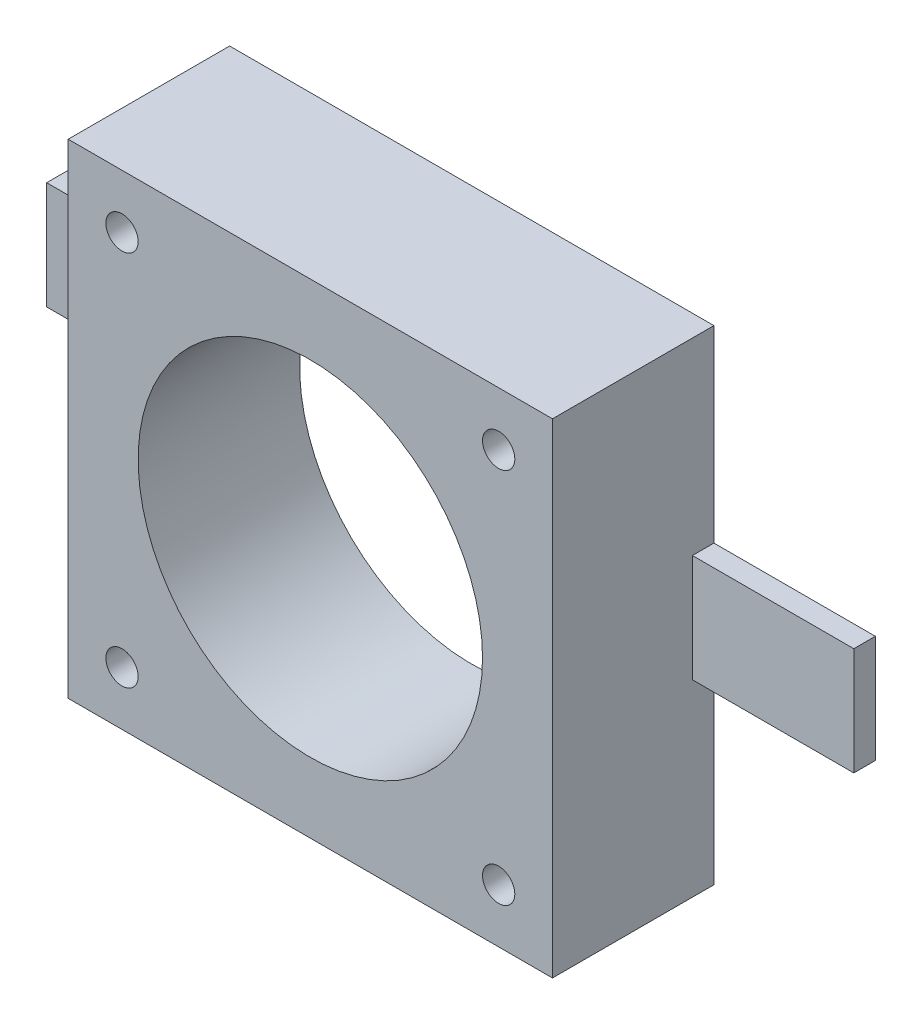
ISO-10303-21;
HEADER;
FILE_DESCRIPTION(('STEP AP214'),'2;1');
FILE_NAME('part.step','',(''),(''),'','','');
FILE_SCHEMA(('AUTOMOTIVE_DESIGN { 1 0 10303 214 1 1 1 1 }'));
ENDSEC;
DATA;
#1=APPLICATION_CONTEXT('core data for automotive mechanical design processes');
#2=APPLICATION_PROTOCOL_DEFINITION('international standard','automotive_design',2000,#1);
#3=PRODUCT_CONTEXT('',#1,'mechanical');
#4=PRODUCT('Part','Part','',(#3));
#5=PRODUCT_RELATED_PRODUCT_CATEGORY('part','',(#4));
#6=PRODUCT_DEFINITION_FORMATION('','',#4);
#7=PRODUCT_DEFINITION_CONTEXT('part definition',#1,'design');
#8=PRODUCT_DEFINITION('design','',#6,#7);
#9=PRODUCT_DEFINITION_SHAPE('','',#8);
#10=(LENGTH_UNIT() NAMED_UNIT(*) SI_UNIT(.MILLI.,.METRE.));
#11=(NAMED_UNIT(*) PLANE_ANGLE_UNIT() SI_UNIT($,.RADIAN.));
#12=(NAMED_UNIT(*) SI_UNIT($,.STERADIAN.) SOLID_ANGLE_UNIT());
#13=UNCERTAINTY_MEASURE_WITH_UNIT(LENGTH_MEASURE(1.E-05),#10,'distance_accuracy_value','');
#14=(GEOMETRIC_REPRESENTATION_CONTEXT(3) GLOBAL_UNCERTAINTY_ASSIGNED_CONTEXT((#13)) GLOBAL_UNIT_ASSIGNED_CONTEXT((#10,
#11,#12)) REPRESENTATION_CONTEXT('',''));
#15=CARTESIAN_POINT('',(0.,0.,0.));
#16=DIRECTION('',(0.,0.,1.));
#17=DIRECTION('',(1.,0.,0.));
#18=AXIS2_PLACEMENT_3D('',#15,#16,#17);
#19=CARTESIAN_POINT('',(22.5,-22.5,15.));
#20=DIRECTION('',(-1.,0.,0.));
#21=DIRECTION('',(0.,0.,1.));
#22=AXIS2_PLACEMENT_3D('',#19,#20,#21);
#23=PLANE('',#22);
#24=DIRECTION('',(0.,0.,-1.));
#25=VECTOR('',#24,1.);
#26=CARTESIAN_POINT('',(22.5,-5.,2.));
#27=LINE('',#26,#25);
#28=CARTESIAN_POINT('',(22.5,-5.,2.));
#29=VERTEX_POINT('',#28);
#30=CARTESIAN_POINT('',(22.5,-5.00000000000001,0.));
#31=VERTEX_POINT('',#30);
#32=EDGE_CURVE('E62',#29,#31,#27,.T.);
#33=ORIENTED_EDGE('',*,*,#32,.F.);
#34=DIRECTION('',(0.,-1.,0.));
#35=VECTOR('',#34,1.);
#36=CARTESIAN_POINT('',(22.5,0.,2.));
#37=LINE('',#36,#35);
#38=CARTESIAN_POINT('',(22.5,5.,2.));
#39=VERTEX_POINT('',#38);
#40=EDGE_CURVE('E179',#39,#29,#37,.T.);
#41=ORIENTED_EDGE('',*,*,#40,.F.);
#42=DIRECTION('',(0.,0.,1.));
#43=VECTOR('',#42,1.);
#44=CARTESIAN_POINT('',(22.5,5.,0.));
#45=LINE('',#44,#43);
#46=CARTESIAN_POINT('',(22.5,4.99999999999999,0.));
#47=VERTEX_POINT('',#46);
#48=EDGE_CURVE('E192',#47,#39,#45,.T.);
#49=ORIENTED_EDGE('',*,*,#48,.F.);
#50=DIRECTION('',(0.,1.,0.));
#51=VECTOR('',#50,1.);
#52=CARTESIAN_POINT('',(22.5,-22.5,0.));
#53=LINE('',#52,#51);
#54=CARTESIAN_POINT('',(22.5,22.5,0.));
#55=VERTEX_POINT('',#54);
#56=EDGE_CURVE('E250',#47,#55,#53,.T.);
#57=ORIENTED_EDGE('',*,*,#56,.T.);
#58=DIRECTION('',(0.,0.,-1.));
#59=VECTOR('',#58,1.);
#60=CARTESIAN_POINT('',(22.5,22.5,15.));
#61=LINE('',#60,#59);
#62=CARTESIAN_POINT('',(22.5,22.5,15.));
#63=VERTEX_POINT('',#62);
#64=EDGE_CURVE('E11',#63,#55,#61,.T.);
#65=ORIENTED_EDGE('',*,*,#64,.F.);
#66=DIRECTION('',(0.,1.,0.));
#67=VECTOR('',#66,1.);
#68=CARTESIAN_POINT('',(22.5,-22.5,15.));
#69=LINE('',#68,#67);
#70=CARTESIAN_POINT('',(22.5,-22.5,15.));
#71=VERTEX_POINT('',#70);
#72=EDGE_CURVE('E254',#71,#63,#69,.T.);
#73=ORIENTED_EDGE('',*,*,#72,.F.);
#74=DIRECTION('',(0.,0.,-1.));
#75=VECTOR('',#74,1.);
#76=CARTESIAN_POINT('',(22.5,-22.5,15.));
#77=LINE('',#76,#75);
#78=CARTESIAN_POINT('',(22.5,-22.5,0.));
#79=VERTEX_POINT('',#78);
#80=EDGE_CURVE('E268',#71,#79,#77,.T.);
#81=ORIENTED_EDGE('',*,*,#80,.T.);
#82=EDGE_CURVE('E269',#79,#31,#53,.T.);
#83=ORIENTED_EDGE('',*,*,#82,.T.);
#84=EDGE_LOOP('',(#33,#41,#49,#57,#65,#73,#81,#83));
#85=FACE_BOUND('',#84,.T.);
#86=ADVANCED_FACE('F39',(#85),#23,.F.);
#87=CARTESIAN_POINT('',(0.,0.,15.));
#88=DIRECTION('',(0.,0.,-1.));
#89=DIRECTION('',(-1.,0.,0.));
#90=AXIS2_PLACEMENT_3D('',#87,#88,#89);
#91=PLANE('',#90);
#92=CARTESIAN_POINT('',(17.5,17.5,15.));
#93=DIRECTION('',(0.,0.,1.));
#94=DIRECTION('',(1.,0.,0.));
#95=AXIS2_PLACEMENT_3D('',#92,#93,#94);
#96=CIRCLE('',#95,1.5);
#97=CARTESIAN_POINT('',(19.,17.5,15.));
#98=VERTEX_POINT('',#97);
#99=EDGE_CURVE('E213',#98,#98,#96,.T.);
#100=ORIENTED_EDGE('',*,*,#99,.F.);
#101=EDGE_LOOP('',(#100));
#102=FACE_BOUND('',#101,.T.);
#103=CARTESIAN_POINT('',(-17.5,-17.5,15.));
#104=DIRECTION('',(0.,0.,1.));
#105=DIRECTION('',(1.,0.,0.));
#106=AXIS2_PLACEMENT_3D('',#103,#104,#105);
#107=CIRCLE('',#106,1.5);
#108=CARTESIAN_POINT('',(-16.,-17.5,15.));
#109=VERTEX_POINT('',#108);
#110=EDGE_CURVE('E227',#109,#109,#107,.T.);
#111=ORIENTED_EDGE('',*,*,#110,.F.);
#112=EDGE_LOOP('',(#111));
#113=FACE_BOUND('',#112,.T.);
#114=CARTESIAN_POINT('',(17.5,-17.5,15.));
#115=DIRECTION('',(0.,0.,1.));
#116=DIRECTION('',(1.,0.,0.));
#117=AXIS2_PLACEMENT_3D('',#114,#115,#116);
#118=CIRCLE('',#117,1.5);
#119=CARTESIAN_POINT('',(19.,-17.5,15.));
#120=VERTEX_POINT('',#119);
#121=EDGE_CURVE('E219',#120,#120,#118,.T.);
#122=ORIENTED_EDGE('',*,*,#121,.F.);
#123=EDGE_LOOP('',(#122));
#124=FACE_BOUND('',#123,.T.);
#125=CARTESIAN_POINT('',(-17.5,17.5,15.));
#126=DIRECTION('',(0.,0.,1.));
#127=DIRECTION('',(1.,0.,0.));
#128=AXIS2_PLACEMENT_3D('',#125,#126,#127);
#129=CIRCLE('',#128,1.5);
#130=CARTESIAN_POINT('',(-16.,17.5,15.));
#131=VERTEX_POINT('',#130);
#132=EDGE_CURVE('E218',#131,#131,#129,.T.);
#133=ORIENTED_EDGE('',*,*,#132,.F.);
#134=EDGE_LOOP('',(#133));
#135=FACE_BOUND('',#134,.T.);
#136=ORIENTED_EDGE('',*,*,#72,.T.);
#137=DIRECTION('',(-1.,0.,0.));
#138=VECTOR('',#137,1.);
#139=CARTESIAN_POINT('',(-22.5,22.5,15.));
#140=LINE('',#139,#138);
#141=CARTESIAN_POINT('',(-22.5,22.5,15.));
#142=VERTEX_POINT('',#141);
#143=EDGE_CURVE('E258',#63,#142,#140,.T.);
#144=ORIENTED_EDGE('',*,*,#143,.T.);
#145=DIRECTION('',(0.,-1.,0.));
#146=VECTOR('',#145,1.);
#147=CARTESIAN_POINT('',(-22.5,-22.5,15.));
#148=LINE('',#147,#146);
#149=CARTESIAN_POINT('',(-22.5,-22.5,15.));
#150=VERTEX_POINT('',#149);
#151=EDGE_CURVE('E262',#142,#150,#148,.T.);
#152=ORIENTED_EDGE('',*,*,#151,.T.);
#153=DIRECTION('',(1.,0.,0.));
#154=VECTOR('',#153,1.);
#155=CARTESIAN_POINT('',(-22.5,-22.5,15.));
#156=LINE('',#155,#154);
#157=EDGE_CURVE('E265',#150,#71,#156,.T.);
#158=ORIENTED_EDGE('',*,*,#157,.T.);
#159=EDGE_LOOP('',(#136,#144,#152,#158));
#160=FACE_BOUND('',#159,.T.);
#161=CARTESIAN_POINT('',(0.,0.,15.));
#162=DIRECTION('',(0.,0.,1.));
#163=DIRECTION('',(1.,0.,0.));
#164=AXIS2_PLACEMENT_3D('',#161,#162,#163);
#165=CIRCLE('',#164,16.);
#166=CARTESIAN_POINT('',(16.,0.,15.));
#167=VERTEX_POINT('',#166);
#168=EDGE_CURVE('E246',#167,#167,#165,.T.);
#169=ORIENTED_EDGE('',*,*,#168,.F.);
#170=EDGE_LOOP('',(#169));
#171=FACE_BOUND('',#170,.T.);
#172=ADVANCED_FACE('F334',(#102,#113,#124,#135,#160,#171),#91,.F.);
#173=CARTESIAN_POINT('',(0.,0.,0.));
#174=DIRECTION('',(0.,0.,-1.));
#175=DIRECTION('',(-1.,0.,0.));
#176=AXIS2_PLACEMENT_3D('',#173,#174,#175);
#177=PLANE('',#176);
#178=CARTESIAN_POINT('',(17.5,17.5,0.));
#179=DIRECTION('',(0.,0.,1.));
#180=DIRECTION('',(1.,0.,0.));
#181=AXIS2_PLACEMENT_3D('',#178,#179,#180);
#182=CIRCLE('',#181,1.5);
#183=CARTESIAN_POINT('',(19.,17.5,0.));
#184=VERTEX_POINT('',#183);
#185=EDGE_CURVE('E231',#184,#184,#182,.T.);
#186=ORIENTED_EDGE('',*,*,#185,.T.);
#187=EDGE_LOOP('',(#186));
#188=FACE_BOUND('',#187,.T.);
#189=CARTESIAN_POINT('',(-17.5,-17.5,0.));
#190=DIRECTION('',(0.,0.,1.));
#191=DIRECTION('',(1.,0.,0.));
#192=AXIS2_PLACEMENT_3D('',#189,#190,#191);
#193=CIRCLE('',#192,1.5);
#194=CARTESIAN_POINT('',(-16.,-17.5,0.));
#195=VERTEX_POINT('',#194);
#196=EDGE_CURVE('E223',#195,#195,#193,.T.);
#197=ORIENTED_EDGE('',*,*,#196,.T.);
#198=EDGE_LOOP('',(#197));
#199=FACE_BOUND('',#198,.T.);
#200=CARTESIAN_POINT('',(17.5,-17.5,0.));
#201=DIRECTION('',(0.,0.,1.));
#202=DIRECTION('',(1.,0.,0.));
#203=AXIS2_PLACEMENT_3D('',#200,#201,#202);
#204=CIRCLE('',#203,1.5);
#205=CARTESIAN_POINT('',(19.,-17.5,0.));
#206=VERTEX_POINT('',#205);
#207=EDGE_CURVE('E214',#206,#206,#204,.T.);
#208=ORIENTED_EDGE('',*,*,#207,.T.);
#209=EDGE_LOOP('',(#208));
#210=FACE_BOUND('',#209,.T.);
#211=CARTESIAN_POINT('',(-17.5,17.5,0.));
#212=DIRECTION('',(0.,0.,1.));
#213=DIRECTION('',(1.,0.,0.));
#214=AXIS2_PLACEMENT_3D('',#211,#212,#213);
#215=CIRCLE('',#214,1.5);
#216=CARTESIAN_POINT('',(-16.,17.5,0.));
#217=VERTEX_POINT('',#216);
#218=EDGE_CURVE('E238',#217,#217,#215,.T.);
#219=ORIENTED_EDGE('',*,*,#218,.T.);
#220=EDGE_LOOP('',(#219));
#221=FACE_BOUND('',#220,.T.);
#222=ORIENTED_EDGE('',*,*,#82,.F.);
#223=DIRECTION('',(1.,0.,0.));
#224=VECTOR('',#223,1.);
#225=CARTESIAN_POINT('',(-22.5,-22.5,0.));
#226=LINE('',#225,#224);
#227=CARTESIAN_POINT('',(-22.5,-22.5,0.));
#228=VERTEX_POINT('',#227);
#229=EDGE_CURVE('E259',#228,#79,#226,.T.);
#230=ORIENTED_EDGE('',*,*,#229,.F.);
#231=DIRECTION('',(0.,-1.,0.));
#232=VECTOR('',#231,1.);
#233=CARTESIAN_POINT('',(-22.5,-22.5,0.));
#234=LINE('',#233,#232);
#235=CARTESIAN_POINT('',(-22.5,-5.,0.));
#236=VERTEX_POINT('',#235);
#237=EDGE_CURVE('E275',#236,#228,#234,.T.);
#238=ORIENTED_EDGE('',*,*,#237,.F.);
#239=DIRECTION('',(1.,0.,0.));
#240=VECTOR('',#239,1.);
#241=CARTESIAN_POINT('',(-37.5,-5.,0.));
#242=LINE('',#241,#240);
#243=CARTESIAN_POINT('',(-37.5,-5.,0.));
#244=VERTEX_POINT('',#243);
#245=EDGE_CURVE('E169',#244,#236,#242,.T.);
#246=ORIENTED_EDGE('',*,*,#245,.F.);
#247=DIRECTION('',(0.,1.,0.));
#248=VECTOR('',#247,1.);
#249=CARTESIAN_POINT('',(-37.5,-5.,0.));
#250=LINE('',#249,#248);
#251=CARTESIAN_POINT('',(-37.5,5.,0.));
#252=VERTEX_POINT('',#251);
#253=EDGE_CURVE('E151',#244,#252,#250,.T.);
#254=ORIENTED_EDGE('',*,*,#253,.T.);
#255=DIRECTION('',(1.,0.,0.));
#256=VECTOR('',#255,1.);
#257=CARTESIAN_POINT('',(-37.5,5.,0.));
#258=LINE('',#257,#256);
#259=CARTESIAN_POINT('',(-22.5,5.,0.));
#260=VERTEX_POINT('',#259);
#261=EDGE_CURVE('E147',#252,#260,#258,.T.);
#262=ORIENTED_EDGE('',*,*,#261,.T.);
#263=CARTESIAN_POINT('',(-22.5,22.5,0.));
#264=VERTEX_POINT('',#263);
#265=EDGE_CURVE('E276',#264,#260,#234,.T.);
#266=ORIENTED_EDGE('',*,*,#265,.F.);
#267=DIRECTION('',(-1.,0.,0.));
#268=VECTOR('',#267,1.);
#269=CARTESIAN_POINT('',(-22.5,22.5,0.));
#270=LINE('',#269,#268);
#271=EDGE_CURVE('E272',#55,#264,#270,.T.);
#272=ORIENTED_EDGE('',*,*,#271,.F.);
#273=ORIENTED_EDGE('',*,*,#56,.F.);
#274=DIRECTION('',(-1.,0.,0.));
#275=VECTOR('',#274,1.);
#276=CARTESIAN_POINT('',(37.5,5.,0.));
#277=LINE('',#276,#275);
#278=CARTESIAN_POINT('',(37.5,5.,0.));
#279=VERTEX_POINT('',#278);
#280=EDGE_CURVE('E201',#279,#47,#277,.T.);
#281=ORIENTED_EDGE('',*,*,#280,.F.);
#282=DIRECTION('',(0.,1.,0.));
#283=VECTOR('',#282,1.);
#284=CARTESIAN_POINT('',(37.5,-5.,0.));
#285=LINE('',#284,#283);
#286=CARTESIAN_POINT('',(37.5,-5.,0.));
#287=VERTEX_POINT('',#286);
#288=EDGE_CURVE('E182',#287,#279,#285,.T.);
#289=ORIENTED_EDGE('',*,*,#288,.F.);
#290=DIRECTION('',(-1.,0.,0.));
#291=VECTOR('',#290,1.);
#292=CARTESIAN_POINT('',(37.5,-5.,0.));
#293=LINE('',#292,#291);
#294=EDGE_CURVE('E205',#287,#31,#293,.T.);
#295=ORIENTED_EDGE('',*,*,#294,.T.);
#296=EDGE_LOOP('',(#222,#230,#238,#246,#254,#262,#266,#272,#273,#281,#289,#295));
#297=FACE_BOUND('',#296,.T.);
#298=CARTESIAN_POINT('',(0.,0.,0.));
#299=DIRECTION('',(0.,0.,1.));
#300=DIRECTION('',(1.,0.,0.));
#301=AXIS2_PLACEMENT_3D('',#298,#299,#300);
#302=CIRCLE('',#301,16.);
#303=CARTESIAN_POINT('',(16.,0.,0.));
#304=VERTEX_POINT('',#303);
#305=EDGE_CURVE('E242',#304,#304,#302,.T.);
#306=ORIENTED_EDGE('',*,*,#305,.T.);
#307=EDGE_LOOP('',(#306));
#308=FACE_BOUND('',#307,.T.);
#309=ADVANCED_FACE('F300',(#188,#199,#210,#221,#297,#308),#177,.T.);
#310=CARTESIAN_POINT('',(-22.5,22.5,15.));
#311=DIRECTION('',(0.,-1.,0.));
#312=DIRECTION('',(0.,0.,-1.));
#313=AXIS2_PLACEMENT_3D('',#310,#311,#312);
#314=PLANE('',#313);
#315=ORIENTED_EDGE('',*,*,#271,.T.);
#316=DIRECTION('',(0.,0.,-1.));
#317=VECTOR('',#316,1.);
#318=CARTESIAN_POINT('',(-22.5,22.5,15.));
#319=LINE('',#318,#317);
#320=EDGE_CURVE('E47',#142,#264,#319,.T.);
#321=ORIENTED_EDGE('',*,*,#320,.F.);
#322=ORIENTED_EDGE('',*,*,#143,.F.);
#323=ORIENTED_EDGE('',*,*,#64,.T.);
#324=EDGE_LOOP('',(#315,#321,#322,#323));
#325=FACE_BOUND('',#324,.T.);
#326=ADVANCED_FACE('F343',(#325),#314,.F.);
#327=CARTESIAN_POINT('',(-22.5,-22.5,15.));
#328=DIRECTION('',(1.,0.,0.));
#329=DIRECTION('',(0.,0.,-1.));
#330=AXIS2_PLACEMENT_3D('',#327,#328,#329);
#331=PLANE('',#330);
#332=DIRECTION('',(0.,-1.,0.));
#333=VECTOR('',#332,1.);
#334=CARTESIAN_POINT('',(-22.5,0.,2.));
#335=LINE('',#334,#333);
#336=CARTESIAN_POINT('',(-22.5,5.,2.));
#337=VERTEX_POINT('',#336);
#338=CARTESIAN_POINT('',(-22.5,-5.,2.));
#339=VERTEX_POINT('',#338);
#340=EDGE_CURVE('E54',#337,#339,#335,.T.);
#341=ORIENTED_EDGE('',*,*,#340,.T.);
#342=DIRECTION('',(0.,0.,-1.));
#343=VECTOR('',#342,1.);
#344=CARTESIAN_POINT('',(-22.5,-5.,2.));
#345=LINE('',#344,#343);
#346=EDGE_CURVE('E139',#339,#236,#345,.T.);
#347=ORIENTED_EDGE('',*,*,#346,.T.);
#348=ORIENTED_EDGE('',*,*,#237,.T.);
#349=DIRECTION('',(0.,0.,-1.));
#350=VECTOR('',#349,1.);
#351=CARTESIAN_POINT('',(-22.5,-22.5,15.));
#352=LINE('',#351,#350);
#353=EDGE_CURVE('E285',#150,#228,#352,.T.);
#354=ORIENTED_EDGE('',*,*,#353,.F.);
#355=ORIENTED_EDGE('',*,*,#151,.F.);
#356=ORIENTED_EDGE('',*,*,#320,.T.);
#357=ORIENTED_EDGE('',*,*,#265,.T.);
#358=DIRECTION('',(0.,0.,1.));
#359=VECTOR('',#358,1.);
#360=CARTESIAN_POINT('',(-22.5,5.,0.));
#361=LINE('',#360,#359);
#362=EDGE_CURVE('E161',#260,#337,#361,.T.);
#363=ORIENTED_EDGE('',*,*,#362,.T.);
#364=EDGE_LOOP('',(#341,#347,#348,#354,#355,#356,#357,#363));
#365=FACE_BOUND('',#364,.T.);
#366=ADVANCED_FACE('F294',(#365),#331,.F.);
#367=CARTESIAN_POINT('',(-22.5,-22.5,15.));
#368=DIRECTION('',(0.,1.,0.));
#369=DIRECTION('',(0.,0.,1.));
#370=AXIS2_PLACEMENT_3D('',#367,#368,#369);
#371=PLANE('',#370);
#372=ORIENTED_EDGE('',*,*,#229,.T.);
#373=ORIENTED_EDGE('',*,*,#80,.F.);
#374=ORIENTED_EDGE('',*,*,#157,.F.);
#375=ORIENTED_EDGE('',*,*,#353,.T.);
#376=EDGE_LOOP('',(#372,#373,#374,#375));
#377=FACE_BOUND('',#376,.T.);
#378=ADVANCED_FACE('F352',(#377),#371,.F.);
#379=CARTESIAN_POINT('',(0.,0.,15.));
#380=DIRECTION('',(0.,0.,-1.));
#381=DIRECTION('',(-1.,0.,0.));
#382=AXIS2_PLACEMENT_3D('',#379,#380,#381);
#383=CYLINDRICAL_SURFACE('',#382,16.);
#384=ORIENTED_EDGE('',*,*,#168,.T.);
#385=EDGE_LOOP('',(#384));
#386=FACE_BOUND('',#385,.T.);
#387=ORIENTED_EDGE('',*,*,#305,.F.);
#388=EDGE_LOOP('',(#387));
#389=FACE_BOUND('',#388,.T.);
#390=ADVANCED_FACE('F349',(#386,#389),#383,.F.);
#391=CARTESIAN_POINT('',(-17.5,17.5,0.));
#392=DIRECTION('',(0.,0.,1.));
#393=DIRECTION('',(1.,0.,0.));
#394=AXIS2_PLACEMENT_3D('',#391,#392,#393);
#395=CYLINDRICAL_SURFACE('',#394,1.5);
#396=ORIENTED_EDGE('',*,*,#218,.F.);
#397=EDGE_LOOP('',(#396));
#398=FACE_BOUND('',#397,.T.);
#399=ORIENTED_EDGE('',*,*,#132,.T.);
#400=EDGE_LOOP('',(#399));
#401=FACE_BOUND('',#400,.T.);
#402=ADVANCED_FACE('F368',(#398,#401),#395,.F.);
#403=CARTESIAN_POINT('',(17.5,-17.5,0.));
#404=DIRECTION('',(0.,0.,1.));
#405=DIRECTION('',(1.,0.,0.));
#406=AXIS2_PLACEMENT_3D('',#403,#404,#405);
#407=CYLINDRICAL_SURFACE('',#406,1.5);
#408=ORIENTED_EDGE('',*,*,#207,.F.);
#409=EDGE_LOOP('',(#408));
#410=FACE_BOUND('',#409,.T.);
#411=ORIENTED_EDGE('',*,*,#121,.T.);
#412=EDGE_LOOP('',(#411));
#413=FACE_BOUND('',#412,.T.);
#414=ADVANCED_FACE('F373',(#410,#413),#407,.F.);
#415=CARTESIAN_POINT('',(-17.5,-17.5,0.));
#416=DIRECTION('',(0.,0.,1.));
#417=DIRECTION('',(1.,0.,0.));
#418=AXIS2_PLACEMENT_3D('',#415,#416,#417);
#419=CYLINDRICAL_SURFACE('',#418,1.5);
#420=ORIENTED_EDGE('',*,*,#196,.F.);
#421=EDGE_LOOP('',(#420));
#422=FACE_BOUND('',#421,.T.);
#423=ORIENTED_EDGE('',*,*,#110,.T.);
#424=EDGE_LOOP('',(#423));
#425=FACE_BOUND('',#424,.T.);
#426=ADVANCED_FACE('F378',(#422,#425),#419,.F.);
#427=CARTESIAN_POINT('',(17.5,17.5,0.));
#428=DIRECTION('',(0.,0.,1.));
#429=DIRECTION('',(1.,0.,0.));
#430=AXIS2_PLACEMENT_3D('',#427,#428,#429);
#431=CYLINDRICAL_SURFACE('',#430,1.5);
#432=ORIENTED_EDGE('',*,*,#185,.F.);
#433=EDGE_LOOP('',(#432));
#434=FACE_BOUND('',#433,.T.);
#435=ORIENTED_EDGE('',*,*,#99,.T.);
#436=EDGE_LOOP('',(#435));
#437=FACE_BOUND('',#436,.T.);
#438=ADVANCED_FACE('F384',(#434,#437),#431,.F.);
#439=CARTESIAN_POINT('',(37.5,-5.,2.));
#440=DIRECTION('',(0.,1.,0.));
#441=DIRECTION('',(0.,0.,1.));
#442=AXIS2_PLACEMENT_3D('',#439,#440,#441);
#443=PLANE('',#442);
#444=ORIENTED_EDGE('',*,*,#32,.T.);
#445=ORIENTED_EDGE('',*,*,#294,.F.);
#446=DIRECTION('',(0.,0.,-1.));
#447=VECTOR('',#446,1.);
#448=CARTESIAN_POINT('',(37.5,-5.,2.));
#449=LINE('',#448,#447);
#450=CARTESIAN_POINT('',(37.5,-5.,2.));
#451=VERTEX_POINT('',#450);
#452=EDGE_CURVE('E178',#451,#287,#449,.T.);
#453=ORIENTED_EDGE('',*,*,#452,.F.);
#454=DIRECTION('',(-1.,0.,0.));
#455=VECTOR('',#454,1.);
#456=CARTESIAN_POINT('',(37.5,-5.,2.));
#457=LINE('',#456,#455);
#458=EDGE_CURVE('E209',#451,#29,#457,.T.);
#459=ORIENTED_EDGE('',*,*,#458,.T.);
#460=EDGE_LOOP('',(#444,#445,#453,#459));
#461=FACE_BOUND('',#460,.T.);
#462=ADVANCED_FACE('F322',(#461),#443,.F.);
#463=CARTESIAN_POINT('',(37.5,5.,0.));
#464=DIRECTION('',(0.,-1.,0.));
#465=DIRECTION('',(0.,0.,-1.));
#466=AXIS2_PLACEMENT_3D('',#463,#464,#465);
#467=PLANE('',#466);
#468=ORIENTED_EDGE('',*,*,#48,.T.);
#469=DIRECTION('',(-1.,0.,0.));
#470=VECTOR('',#469,1.);
#471=CARTESIAN_POINT('',(37.5,5.,2.));
#472=LINE('',#471,#470);
#473=CARTESIAN_POINT('',(37.5,5.,2.));
#474=VERTEX_POINT('',#473);
#475=EDGE_CURVE('E189',#474,#39,#472,.T.);
#476=ORIENTED_EDGE('',*,*,#475,.F.);
#477=DIRECTION('',(0.,0.,1.));
#478=VECTOR('',#477,1.);
#479=CARTESIAN_POINT('',(37.5,5.,0.));
#480=LINE('',#479,#478);
#481=EDGE_CURVE('E185',#279,#474,#480,.T.);
#482=ORIENTED_EDGE('',*,*,#481,.F.);
#483=ORIENTED_EDGE('',*,*,#280,.T.);
#484=EDGE_LOOP('',(#468,#476,#482,#483));
#485=FACE_BOUND('',#484,.T.);
#486=ADVANCED_FACE('F315',(#485),#467,.F.);
#487=CARTESIAN_POINT('',(37.5,0.,2.));
#488=DIRECTION('',(0.,0.,-1.));
#489=DIRECTION('',(-1.,0.,0.));
#490=AXIS2_PLACEMENT_3D('',#487,#488,#489);
#491=PLANE('',#490);
#492=ORIENTED_EDGE('',*,*,#40,.T.);
#493=ORIENTED_EDGE('',*,*,#458,.F.);
#494=DIRECTION('',(0.,-1.,0.));
#495=VECTOR('',#494,1.);
#496=CARTESIAN_POINT('',(37.5,0.,2.));
#497=LINE('',#496,#495);
#498=EDGE_CURVE('E174',#474,#451,#497,.T.);
#499=ORIENTED_EDGE('',*,*,#498,.F.);
#500=ORIENTED_EDGE('',*,*,#475,.T.);
#501=EDGE_LOOP('',(#492,#493,#499,#500));
#502=FACE_BOUND('',#501,.T.);
#503=ADVANCED_FACE('F324',(#502),#491,.F.);
#504=CARTESIAN_POINT('',(37.5,0.,0.));
#505=DIRECTION('',(1.,0.,0.));
#506=DIRECTION('',(0.,0.,-1.));
#507=AXIS2_PLACEMENT_3D('',#504,#505,#506);
#508=PLANE('',#507);
#509=ORIENTED_EDGE('',*,*,#498,.T.);
#510=ORIENTED_EDGE('',*,*,#452,.T.);
#511=ORIENTED_EDGE('',*,*,#288,.T.);
#512=ORIENTED_EDGE('',*,*,#481,.T.);
#513=EDGE_LOOP('',(#509,#510,#511,#512));
#514=FACE_BOUND('',#513,.T.);
#515=ADVANCED_FACE('F318',(#514),#508,.T.);
#516=CARTESIAN_POINT('',(-37.5,0.,2.));
#517=DIRECTION('',(0.,0.,1.));
#518=DIRECTION('',(1.,0.,0.));
#519=AXIS2_PLACEMENT_3D('',#516,#517,#518);
#520=PLANE('',#519);
#521=ORIENTED_EDGE('',*,*,#340,.F.);
#522=DIRECTION('',(1.,0.,0.));
#523=VECTOR('',#522,1.);
#524=CARTESIAN_POINT('',(-37.5,5.,2.));
#525=LINE('',#524,#523);
#526=CARTESIAN_POINT('',(-37.5,5.,2.));
#527=VERTEX_POINT('',#526);
#528=EDGE_CURVE('E141',#527,#337,#525,.T.);
#529=ORIENTED_EDGE('',*,*,#528,.F.);
#530=DIRECTION('',(0.,-1.,0.));
#531=VECTOR('',#530,1.);
#532=CARTESIAN_POINT('',(-37.5,0.,2.));
#533=LINE('',#532,#531);
#534=CARTESIAN_POINT('',(-37.5,-5.,2.));
#535=VERTEX_POINT('',#534);
#536=EDGE_CURVE('E130',#527,#535,#533,.T.);
#537=ORIENTED_EDGE('',*,*,#536,.T.);
#538=DIRECTION('',(1.,0.,0.));
#539=VECTOR('',#538,1.);
#540=CARTESIAN_POINT('',(-37.5,-5.,2.));
#541=LINE('',#540,#539);
#542=EDGE_CURVE('E158',#535,#339,#541,.T.);
#543=ORIENTED_EDGE('',*,*,#542,.T.);
#544=EDGE_LOOP('',(#521,#529,#537,#543));
#545=FACE_BOUND('',#544,.T.);
#546=ADVANCED_FACE('F142',(#545),#520,.T.);
#547=CARTESIAN_POINT('',(-37.5,5.,0.));
#548=DIRECTION('',(0.,1.,0.));
#549=DIRECTION('',(0.,0.,1.));
#550=AXIS2_PLACEMENT_3D('',#547,#548,#549);
#551=PLANE('',#550);
#552=ORIENTED_EDGE('',*,*,#362,.F.);
#553=ORIENTED_EDGE('',*,*,#261,.F.);
#554=DIRECTION('',(0.,0.,1.));
#555=VECTOR('',#554,1.);
#556=CARTESIAN_POINT('',(-37.5,5.,0.));
#557=LINE('',#556,#555);
#558=EDGE_CURVE('E134',#252,#527,#557,.T.);
#559=ORIENTED_EDGE('',*,*,#558,.T.);
#560=ORIENTED_EDGE('',*,*,#528,.T.);
#561=EDGE_LOOP('',(#552,#553,#559,#560));
#562=FACE_BOUND('',#561,.T.);
#563=ADVANCED_FACE('F149',(#562),#551,.T.);
#564=CARTESIAN_POINT('',(-37.5,-5.,2.));
#565=DIRECTION('',(0.,-1.,0.));
#566=DIRECTION('',(0.,0.,-1.));
#567=AXIS2_PLACEMENT_3D('',#564,#565,#566);
#568=PLANE('',#567);
#569=ORIENTED_EDGE('',*,*,#346,.F.);
#570=ORIENTED_EDGE('',*,*,#542,.F.);
#571=DIRECTION('',(0.,0.,-1.));
#572=VECTOR('',#571,1.);
#573=CARTESIAN_POINT('',(-37.5,-5.,2.));
#574=LINE('',#573,#572);
#575=EDGE_CURVE('E137',#535,#244,#574,.T.);
#576=ORIENTED_EDGE('',*,*,#575,.T.);
#577=ORIENTED_EDGE('',*,*,#245,.T.);
#578=EDGE_LOOP('',(#569,#570,#576,#577));
#579=FACE_BOUND('',#578,.T.);
#580=ADVANCED_FACE('F444',(#579),#568,.T.);
#581=CARTESIAN_POINT('',(-37.5,0.,0.));
#582=DIRECTION('',(-1.,0.,0.));
#583=DIRECTION('',(0.,0.,-1.));
#584=AXIS2_PLACEMENT_3D('',#581,#582,#583);
#585=PLANE('',#584);
#586=ORIENTED_EDGE('',*,*,#536,.F.);
#587=ORIENTED_EDGE('',*,*,#558,.F.);
#588=ORIENTED_EDGE('',*,*,#253,.F.);
#589=ORIENTED_EDGE('',*,*,#575,.F.);
#590=EDGE_LOOP('',(#586,#587,#588,#589));
#591=FACE_BOUND('',#590,.T.);
#592=ADVANCED_FACE('F131',(#591),#585,.T.);
#593=CLOSED_SHELL('',(#86,#172,#309,#326,#366,#378,#390,#402,#414,#426,#438,#462,#486,#503,#515,
#546,#563,#580,#592));
#594=MANIFOLD_SOLID_BREP('B2',#593);
#595=ADVANCED_BREP_SHAPE_REPRESENTATION('',(#18,#594),#14);
#596=SHAPE_DEFINITION_REPRESENTATION(#9,#595);
ENDSEC;
END-ISO-10303-21;
